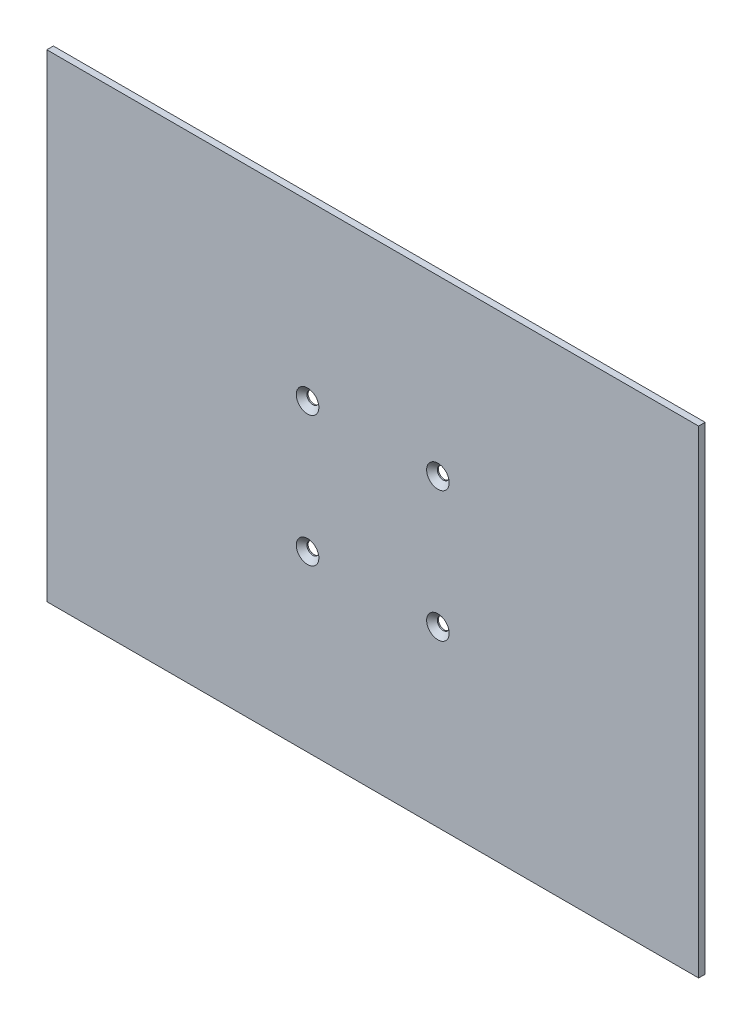
ISO-10303-21;
HEADER;
FILE_DESCRIPTION(('STEP AP214'),'2;1');
FILE_NAME('part.step','',(''),(''),'','','');
FILE_SCHEMA(('AUTOMOTIVE_DESIGN { 1 0 10303 214 1 1 1 1 }'));
ENDSEC;
DATA;
#1=APPLICATION_CONTEXT('core data for automotive mechanical design processes');
#2=APPLICATION_PROTOCOL_DEFINITION('international standard','automotive_design',2000,#1);
#3=PRODUCT_CONTEXT('',#1,'mechanical');
#4=PRODUCT('Part','Part','',(#3));
#5=PRODUCT_RELATED_PRODUCT_CATEGORY('part','',(#4));
#6=PRODUCT_DEFINITION_FORMATION('','',#4);
#7=PRODUCT_DEFINITION_CONTEXT('part definition',#1,'design');
#8=PRODUCT_DEFINITION('design','',#6,#7);
#9=PRODUCT_DEFINITION_SHAPE('','',#8);
#10=(LENGTH_UNIT() NAMED_UNIT(*) SI_UNIT(.MILLI.,.METRE.));
#11=(NAMED_UNIT(*) PLANE_ANGLE_UNIT() SI_UNIT($,.RADIAN.));
#12=(NAMED_UNIT(*) SI_UNIT($,.STERADIAN.) SOLID_ANGLE_UNIT());
#13=UNCERTAINTY_MEASURE_WITH_UNIT(LENGTH_MEASURE(1.E-05),#10,'distance_accuracy_value','');
#14=(GEOMETRIC_REPRESENTATION_CONTEXT(3) GLOBAL_UNCERTAINTY_ASSIGNED_CONTEXT((#13)) GLOBAL_UNIT_ASSIGNED_CONTEXT((#10,
#11,#12)) REPRESENTATION_CONTEXT('',''));
#15=CARTESIAN_POINT('',(0.,0.,0.));
#16=DIRECTION('',(0.,0.,1.));
#17=DIRECTION('',(1.,0.,0.));
#18=AXIS2_PLACEMENT_3D('',#15,#16,#17);
#19=CARTESIAN_POINT('',(-150.,-110.,3.));
#20=DIRECTION('',(1.,0.,0.));
#21=DIRECTION('',(0.,0.,-1.));
#22=AXIS2_PLACEMENT_3D('',#19,#20,#21);
#23=PLANE('',#22);
#24=DIRECTION('',(0.,-1.,0.));
#25=VECTOR('',#24,1.);
#26=CARTESIAN_POINT('',(-150.,-110.,0.));
#27=LINE('',#26,#25);
#28=CARTESIAN_POINT('',(-150.,110.,0.));
#29=VERTEX_POINT('',#28);
#30=CARTESIAN_POINT('',(-150.,-110.,0.));
#31=VERTEX_POINT('',#30);
#32=EDGE_CURVE('E102',#29,#31,#27,.T.);
#33=ORIENTED_EDGE('',*,*,#32,.T.);
#34=DIRECTION('',(0.,0.,-1.));
#35=VECTOR('',#34,1.);
#36=CARTESIAN_POINT('',(-150.,-110.,3.));
#37=LINE('',#36,#35);
#38=CARTESIAN_POINT('',(-150.,-110.,3.));
#39=VERTEX_POINT('',#38);
#40=EDGE_CURVE('E11',#39,#31,#37,.T.);
#41=ORIENTED_EDGE('',*,*,#40,.F.);
#42=DIRECTION('',(0.,-1.,0.));
#43=VECTOR('',#42,1.);
#44=CARTESIAN_POINT('',(-150.,-110.,3.));
#45=LINE('',#44,#43);
#46=CARTESIAN_POINT('',(-150.,110.,3.));
#47=VERTEX_POINT('',#46);
#48=EDGE_CURVE('E90',#47,#39,#45,.T.);
#49=ORIENTED_EDGE('',*,*,#48,.F.);
#50=DIRECTION('',(0.,0.,-1.));
#51=VECTOR('',#50,1.);
#52=CARTESIAN_POINT('',(-150.,110.,3.));
#53=LINE('',#52,#51);
#54=EDGE_CURVE('E98',#47,#29,#53,.T.);
#55=ORIENTED_EDGE('',*,*,#54,.T.);
#56=EDGE_LOOP('',(#33,#41,#49,#55));
#57=FACE_BOUND('',#56,.T.);
#58=ADVANCED_FACE('F39',(#57),#23,.F.);
#59=CARTESIAN_POINT('',(150.,-110.,3.));
#60=DIRECTION('',(0.,1.,0.));
#61=DIRECTION('',(-1.,0.,0.));
#62=AXIS2_PLACEMENT_3D('',#59,#60,#61);
#63=PLANE('',#62);
#64=DIRECTION('',(1.,0.,0.));
#65=VECTOR('',#64,1.);
#66=CARTESIAN_POINT('',(150.,-110.,0.));
#67=LINE('',#66,#65);
#68=CARTESIAN_POINT('',(150.,-110.,0.));
#69=VERTEX_POINT('',#68);
#70=EDGE_CURVE('E94',#31,#69,#67,.T.);
#71=ORIENTED_EDGE('',*,*,#70,.T.);
#72=DIRECTION('',(0.,0.,-1.));
#73=VECTOR('',#72,1.);
#74=CARTESIAN_POINT('',(150.,-110.,3.));
#75=LINE('',#74,#73);
#76=CARTESIAN_POINT('',(150.,-110.,3.));
#77=VERTEX_POINT('',#76);
#78=EDGE_CURVE('E47',#77,#69,#75,.T.);
#79=ORIENTED_EDGE('',*,*,#78,.F.);
#80=DIRECTION('',(1.,0.,0.));
#81=VECTOR('',#80,1.);
#82=CARTESIAN_POINT('',(150.,-110.,3.));
#83=LINE('',#82,#81);
#84=EDGE_CURVE('E85',#39,#77,#83,.T.);
#85=ORIENTED_EDGE('',*,*,#84,.F.);
#86=ORIENTED_EDGE('',*,*,#40,.T.);
#87=EDGE_LOOP('',(#71,#79,#85,#86));
#88=FACE_BOUND('',#87,.T.);
#89=ADVANCED_FACE('F93',(#88),#63,.F.);
#90=CARTESIAN_POINT('',(150.,-110.,3.));
#91=DIRECTION('',(-1.,0.,0.));
#92=DIRECTION('',(0.,0.,1.));
#93=AXIS2_PLACEMENT_3D('',#90,#91,#92);
#94=PLANE('',#93);
#95=DIRECTION('',(0.,1.,0.));
#96=VECTOR('',#95,1.);
#97=CARTESIAN_POINT('',(150.,-110.,0.));
#98=LINE('',#97,#96);
#99=CARTESIAN_POINT('',(150.,110.,0.));
#100=VERTEX_POINT('',#99);
#101=EDGE_CURVE('E72',#69,#100,#98,.T.);
#102=ORIENTED_EDGE('',*,*,#101,.T.);
#103=DIRECTION('',(0.,0.,-1.));
#104=VECTOR('',#103,1.);
#105=CARTESIAN_POINT('',(150.,110.,3.));
#106=LINE('',#105,#104);
#107=CARTESIAN_POINT('',(150.,110.,3.));
#108=VERTEX_POINT('',#107);
#109=EDGE_CURVE('E95',#108,#100,#106,.T.);
#110=ORIENTED_EDGE('',*,*,#109,.F.);
#111=DIRECTION('',(0.,1.,0.));
#112=VECTOR('',#111,1.);
#113=CARTESIAN_POINT('',(150.,-110.,3.));
#114=LINE('',#113,#112);
#115=EDGE_CURVE('E88',#77,#108,#114,.T.);
#116=ORIENTED_EDGE('',*,*,#115,.F.);
#117=ORIENTED_EDGE('',*,*,#78,.T.);
#118=EDGE_LOOP('',(#102,#110,#116,#117));
#119=FACE_BOUND('',#118,.T.);
#120=ADVANCED_FACE('F96',(#119),#94,.F.);
#121=CARTESIAN_POINT('',(150.,110.,3.));
#122=DIRECTION('',(0.,-1.,0.));
#123=DIRECTION('',(1.,0.,0.));
#124=AXIS2_PLACEMENT_3D('',#121,#122,#123);
#125=PLANE('',#124);
#126=DIRECTION('',(-1.,0.,0.));
#127=VECTOR('',#126,1.);
#128=CARTESIAN_POINT('',(150.,110.,0.));
#129=LINE('',#128,#127);
#130=EDGE_CURVE('E78',#100,#29,#129,.T.);
#131=ORIENTED_EDGE('',*,*,#130,.T.);
#132=ORIENTED_EDGE('',*,*,#54,.F.);
#133=DIRECTION('',(-1.,0.,0.));
#134=VECTOR('',#133,1.);
#135=CARTESIAN_POINT('',(150.,110.,3.));
#136=LINE('',#135,#134);
#137=EDGE_CURVE('E55',#108,#47,#136,.T.);
#138=ORIENTED_EDGE('',*,*,#137,.F.);
#139=ORIENTED_EDGE('',*,*,#109,.T.);
#140=EDGE_LOOP('',(#131,#132,#138,#139));
#141=FACE_BOUND('',#140,.T.);
#142=ADVANCED_FACE('F110',(#141),#125,.F.);
#143=CARTESIAN_POINT('',(0.,0.,3.));
#144=DIRECTION('',(0.,0.,1.));
#145=DIRECTION('',(1.,0.,0.));
#146=AXIS2_PLACEMENT_3D('',#143,#144,#145);
#147=PLANE('',#146);
#148=CARTESIAN_POINT('',(-29.9999999999994,29.9999999999996,3.));
#149=DIRECTION('',(0.,0.,1.));
#150=DIRECTION('',(1.,0.,0.));
#151=AXIS2_PLACEMENT_3D('',#148,#149,#150);
#152=CIRCLE('',#151,5.2);
#153=CARTESIAN_POINT('',(-24.7999999999994,29.9999999999996,3.));
#154=VERTEX_POINT('',#153);
#155=EDGE_CURVE('E148',#154,#154,#152,.T.);
#156=ORIENTED_EDGE('',*,*,#155,.F.);
#157=EDGE_LOOP('',(#156));
#158=FACE_BOUND('',#157,.T.);
#159=CARTESIAN_POINT('',(30.0000000000008,29.9999999999996,3.));
#160=DIRECTION('',(0.,0.,1.));
#161=DIRECTION('',(1.,0.,0.));
#162=AXIS2_PLACEMENT_3D('',#159,#160,#161);
#163=CIRCLE('',#162,5.2);
#164=CARTESIAN_POINT('',(35.2000000000008,29.9999999999996,3.));
#165=VERTEX_POINT('',#164);
#166=EDGE_CURVE('E139',#165,#165,#163,.T.);
#167=ORIENTED_EDGE('',*,*,#166,.F.);
#168=EDGE_LOOP('',(#167));
#169=FACE_BOUND('',#168,.T.);
#170=CARTESIAN_POINT('',(-29.9999999999991,-30.0000000000005,3.));
#171=DIRECTION('',(0.,0.,1.));
#172=DIRECTION('',(1.,0.,0.));
#173=AXIS2_PLACEMENT_3D('',#170,#171,#172);
#174=CIRCLE('',#173,5.2);
#175=CARTESIAN_POINT('',(-24.7999999999991,-30.0000000000005,3.));
#176=VERTEX_POINT('',#175);
#177=EDGE_CURVE('E130',#176,#176,#174,.T.);
#178=ORIENTED_EDGE('',*,*,#177,.F.);
#179=EDGE_LOOP('',(#178));
#180=FACE_BOUND('',#179,.T.);
#181=CARTESIAN_POINT('',(30.0000000000009,-30.0000000000005,3.));
#182=DIRECTION('',(0.,0.,1.));
#183=DIRECTION('',(1.,0.,0.));
#184=AXIS2_PLACEMENT_3D('',#181,#182,#183);
#185=CIRCLE('',#184,5.2);
#186=CARTESIAN_POINT('',(35.2000000000009,-30.0000000000005,3.));
#187=VERTEX_POINT('',#186);
#188=EDGE_CURVE('E121',#187,#187,#185,.T.);
#189=ORIENTED_EDGE('',*,*,#188,.F.);
#190=EDGE_LOOP('',(#189));
#191=FACE_BOUND('',#190,.T.);
#192=ORIENTED_EDGE('',*,*,#48,.T.);
#193=ORIENTED_EDGE('',*,*,#84,.T.);
#194=ORIENTED_EDGE('',*,*,#115,.T.);
#195=ORIENTED_EDGE('',*,*,#137,.T.);
#196=EDGE_LOOP('',(#192,#193,#194,#195));
#197=FACE_BOUND('',#196,.T.);
#198=ADVANCED_FACE('F86',(#158,#169,#180,#191,#197),#147,.T.);
#199=CARTESIAN_POINT('',(0.,0.,0.));
#200=DIRECTION('',(0.,0.,1.));
#201=DIRECTION('',(1.,0.,0.));
#202=AXIS2_PLACEMENT_3D('',#199,#200,#201);
#203=PLANE('',#202);
#204=CARTESIAN_POINT('',(-29.9999999999994,29.9999999999996,0.));
#205=DIRECTION('',(0.,0.,1.));
#206=DIRECTION('',(1.,0.,0.));
#207=AXIS2_PLACEMENT_3D('',#204,#205,#206);
#208=CIRCLE('',#207,2.75);
#209=CARTESIAN_POINT('',(-27.2499999999994,29.9999999999996,0.));
#210=VERTEX_POINT('',#209);
#211=EDGE_CURVE('E142',#210,#210,#208,.T.);
#212=ORIENTED_EDGE('',*,*,#211,.T.);
#213=EDGE_LOOP('',(#212));
#214=FACE_BOUND('',#213,.T.);
#215=CARTESIAN_POINT('',(30.0000000000008,29.9999999999996,0.));
#216=DIRECTION('',(0.,0.,1.));
#217=DIRECTION('',(1.,0.,0.));
#218=AXIS2_PLACEMENT_3D('',#215,#216,#217);
#219=CIRCLE('',#218,2.75);
#220=CARTESIAN_POINT('',(32.7500000000008,29.9999999999996,0.));
#221=VERTEX_POINT('',#220);
#222=EDGE_CURVE('E133',#221,#221,#219,.T.);
#223=ORIENTED_EDGE('',*,*,#222,.T.);
#224=EDGE_LOOP('',(#223));
#225=FACE_BOUND('',#224,.T.);
#226=CARTESIAN_POINT('',(-29.9999999999991,-30.0000000000005,0.));
#227=DIRECTION('',(0.,0.,1.));
#228=DIRECTION('',(1.,0.,0.));
#229=AXIS2_PLACEMENT_3D('',#226,#227,#228);
#230=CIRCLE('',#229,2.75);
#231=CARTESIAN_POINT('',(-27.2499999999991,-30.0000000000005,0.));
#232=VERTEX_POINT('',#231);
#233=EDGE_CURVE('E124',#232,#232,#230,.T.);
#234=ORIENTED_EDGE('',*,*,#233,.T.);
#235=EDGE_LOOP('',(#234));
#236=FACE_BOUND('',#235,.T.);
#237=CARTESIAN_POINT('',(30.0000000000009,-30.0000000000005,0.));
#238=DIRECTION('',(0.,0.,1.));
#239=DIRECTION('',(1.,0.,0.));
#240=AXIS2_PLACEMENT_3D('',#237,#238,#239);
#241=CIRCLE('',#240,2.75);
#242=CARTESIAN_POINT('',(32.7500000000009,-30.0000000000005,0.));
#243=VERTEX_POINT('',#242);
#244=EDGE_CURVE('E105',#243,#243,#241,.T.);
#245=ORIENTED_EDGE('',*,*,#244,.T.);
#246=EDGE_LOOP('',(#245));
#247=FACE_BOUND('',#246,.T.);
#248=ORIENTED_EDGE('',*,*,#32,.F.);
#249=ORIENTED_EDGE('',*,*,#130,.F.);
#250=ORIENTED_EDGE('',*,*,#101,.F.);
#251=ORIENTED_EDGE('',*,*,#70,.F.);
#252=EDGE_LOOP('',(#248,#249,#250,#251));
#253=FACE_BOUND('',#252,.T.);
#254=ADVANCED_FACE('F113',(#214,#225,#236,#247,#253),#203,.F.);
#255=CARTESIAN_POINT('',(30.0000000000009,-30.0000000000005,3.));
#256=DIRECTION('',(0.,0.,1.));
#257=DIRECTION('',(1.,0.,0.));
#258=AXIS2_PLACEMENT_3D('',#255,#256,#257);
#259=CYLINDRICAL_SURFACE('',#258,2.75);
#260=ORIENTED_EDGE('',*,*,#244,.F.);
#261=EDGE_LOOP('',(#260));
#262=FACE_BOUND('',#261,.T.);
#263=CARTESIAN_POINT('',(30.0000000000009,-30.0000000000005,0.549999999999997));
#264=DIRECTION('',(0.,0.,1.));
#265=DIRECTION('',(1.,0.,0.));
#266=AXIS2_PLACEMENT_3D('',#263,#264,#265);
#267=CIRCLE('',#266,2.75);
#268=CARTESIAN_POINT('',(32.7500000000009,-30.0000000000005,0.549999999999997));
#269=VERTEX_POINT('',#268);
#270=EDGE_CURVE('E118',#269,#269,#267,.T.);
#271=ORIENTED_EDGE('',*,*,#270,.T.);
#272=EDGE_LOOP('',(#271));
#273=FACE_BOUND('',#272,.T.);
#274=ADVANCED_FACE('F166',(#262,#273),#259,.F.);
#275=CARTESIAN_POINT('',(30.0000000000009,-30.0000000000005,3.));
#276=DIRECTION('',(0.,0.,1.));
#277=DIRECTION('',(1.,0.,0.));
#278=AXIS2_PLACEMENT_3D('',#275,#276,#277);
#279=CONICAL_SURFACE('',#278,5.2,0.785398163397446);
#280=ORIENTED_EDGE('',*,*,#270,.F.);
#281=EDGE_LOOP('',(#280));
#282=FACE_BOUND('',#281,.T.);
#283=ORIENTED_EDGE('',*,*,#188,.T.);
#284=EDGE_LOOP('',(#283));
#285=FACE_BOUND('',#284,.T.);
#286=ADVANCED_FACE('F163',(#282,#285),#279,.F.);
#287=CARTESIAN_POINT('',(-29.9999999999991,-30.0000000000005,3.));
#288=DIRECTION('',(0.,0.,1.));
#289=DIRECTION('',(1.,0.,0.));
#290=AXIS2_PLACEMENT_3D('',#287,#288,#289);
#291=CYLINDRICAL_SURFACE('',#290,2.75);
#292=ORIENTED_EDGE('',*,*,#233,.F.);
#293=EDGE_LOOP('',(#292));
#294=FACE_BOUND('',#293,.T.);
#295=CARTESIAN_POINT('',(-29.9999999999991,-30.0000000000005,0.549999999999997));
#296=DIRECTION('',(0.,0.,1.));
#297=DIRECTION('',(1.,0.,0.));
#298=AXIS2_PLACEMENT_3D('',#295,#296,#297);
#299=CIRCLE('',#298,2.75);
#300=CARTESIAN_POINT('',(-27.2499999999991,-30.0000000000005,0.549999999999997));
#301=VERTEX_POINT('',#300);
#302=EDGE_CURVE('E127',#301,#301,#299,.T.);
#303=ORIENTED_EDGE('',*,*,#302,.T.);
#304=EDGE_LOOP('',(#303));
#305=FACE_BOUND('',#304,.T.);
#306=ADVANCED_FACE('F165',(#294,#305),#291,.F.);
#307=CARTESIAN_POINT('',(-29.9999999999991,-30.0000000000005,3.));
#308=DIRECTION('',(0.,0.,1.));
#309=DIRECTION('',(1.,0.,0.));
#310=AXIS2_PLACEMENT_3D('',#307,#308,#309);
#311=CONICAL_SURFACE('',#310,5.2,0.785398163397448);
#312=ORIENTED_EDGE('',*,*,#302,.F.);
#313=EDGE_LOOP('',(#312));
#314=FACE_BOUND('',#313,.T.);
#315=ORIENTED_EDGE('',*,*,#177,.T.);
#316=EDGE_LOOP('',(#315));
#317=FACE_BOUND('',#316,.T.);
#318=ADVANCED_FACE('F173',(#314,#317),#311,.F.);
#319=CARTESIAN_POINT('',(30.0000000000008,29.9999999999996,3.));
#320=DIRECTION('',(0.,0.,1.));
#321=DIRECTION('',(1.,0.,0.));
#322=AXIS2_PLACEMENT_3D('',#319,#320,#321);
#323=CYLINDRICAL_SURFACE('',#322,2.75);
#324=ORIENTED_EDGE('',*,*,#222,.F.);
#325=EDGE_LOOP('',(#324));
#326=FACE_BOUND('',#325,.T.);
#327=CARTESIAN_POINT('',(30.0000000000008,29.9999999999996,0.549999999999997));
#328=DIRECTION('',(0.,0.,1.));
#329=DIRECTION('',(1.,0.,0.));
#330=AXIS2_PLACEMENT_3D('',#327,#328,#329);
#331=CIRCLE('',#330,2.75);
#332=CARTESIAN_POINT('',(32.7500000000008,29.9999999999996,0.549999999999997));
#333=VERTEX_POINT('',#332);
#334=EDGE_CURVE('E136',#333,#333,#331,.T.);
#335=ORIENTED_EDGE('',*,*,#334,.T.);
#336=EDGE_LOOP('',(#335));
#337=FACE_BOUND('',#336,.T.);
#338=ADVANCED_FACE('F207',(#326,#337),#323,.F.);
#339=CARTESIAN_POINT('',(30.0000000000008,29.9999999999996,3.));
#340=DIRECTION('',(0.,0.,1.));
#341=DIRECTION('',(1.,0.,0.));
#342=AXIS2_PLACEMENT_3D('',#339,#340,#341);
#343=CONICAL_SURFACE('',#342,5.2,0.785398163397446);
#344=ORIENTED_EDGE('',*,*,#334,.F.);
#345=EDGE_LOOP('',(#344));
#346=FACE_BOUND('',#345,.T.);
#347=ORIENTED_EDGE('',*,*,#166,.T.);
#348=EDGE_LOOP('',(#347));
#349=FACE_BOUND('',#348,.T.);
#350=ADVANCED_FACE('F212',(#346,#349),#343,.F.);
#351=CARTESIAN_POINT('',(-29.9999999999994,29.9999999999996,3.));
#352=DIRECTION('',(0.,0.,1.));
#353=DIRECTION('',(1.,0.,0.));
#354=AXIS2_PLACEMENT_3D('',#351,#352,#353);
#355=CYLINDRICAL_SURFACE('',#354,2.75);
#356=ORIENTED_EDGE('',*,*,#211,.F.);
#357=EDGE_LOOP('',(#356));
#358=FACE_BOUND('',#357,.T.);
#359=CARTESIAN_POINT('',(-29.9999999999994,29.9999999999996,0.549999999999997));
#360=DIRECTION('',(0.,0.,1.));
#361=DIRECTION('',(1.,0.,0.));
#362=AXIS2_PLACEMENT_3D('',#359,#360,#361);
#363=CIRCLE('',#362,2.75);
#364=CARTESIAN_POINT('',(-27.2499999999994,29.9999999999996,0.549999999999997));
#365=VERTEX_POINT('',#364);
#366=EDGE_CURVE('E145',#365,#365,#363,.T.);
#367=ORIENTED_EDGE('',*,*,#366,.T.);
#368=EDGE_LOOP('',(#367));
#369=FACE_BOUND('',#368,.T.);
#370=ADVANCED_FACE('F218',(#358,#369),#355,.F.);
#371=CARTESIAN_POINT('',(-29.9999999999994,29.9999999999996,3.));
#372=DIRECTION('',(0.,0.,1.));
#373=DIRECTION('',(1.,0.,0.));
#374=AXIS2_PLACEMENT_3D('',#371,#372,#373);
#375=CONICAL_SURFACE('',#374,5.2,0.785398163397448);
#376=ORIENTED_EDGE('',*,*,#366,.F.);
#377=EDGE_LOOP('',(#376));
#378=FACE_BOUND('',#377,.T.);
#379=ORIENTED_EDGE('',*,*,#155,.T.);
#380=EDGE_LOOP('',(#379));
#381=FACE_BOUND('',#380,.T.);
#382=ADVANCED_FACE('F152',(#378,#381),#375,.F.);
#383=CLOSED_SHELL('',(#58,#89,#120,#142,#198,#254,#274,#286,#306,#318,#338,#350,#370,#382));
#384=MANIFOLD_SOLID_BREP('B2',#383);
#385=ADVANCED_BREP_SHAPE_REPRESENTATION('',(#18,#384),#14);
#386=SHAPE_DEFINITION_REPRESENTATION(#9,#385);
ENDSEC;
END-ISO-10303-21;
